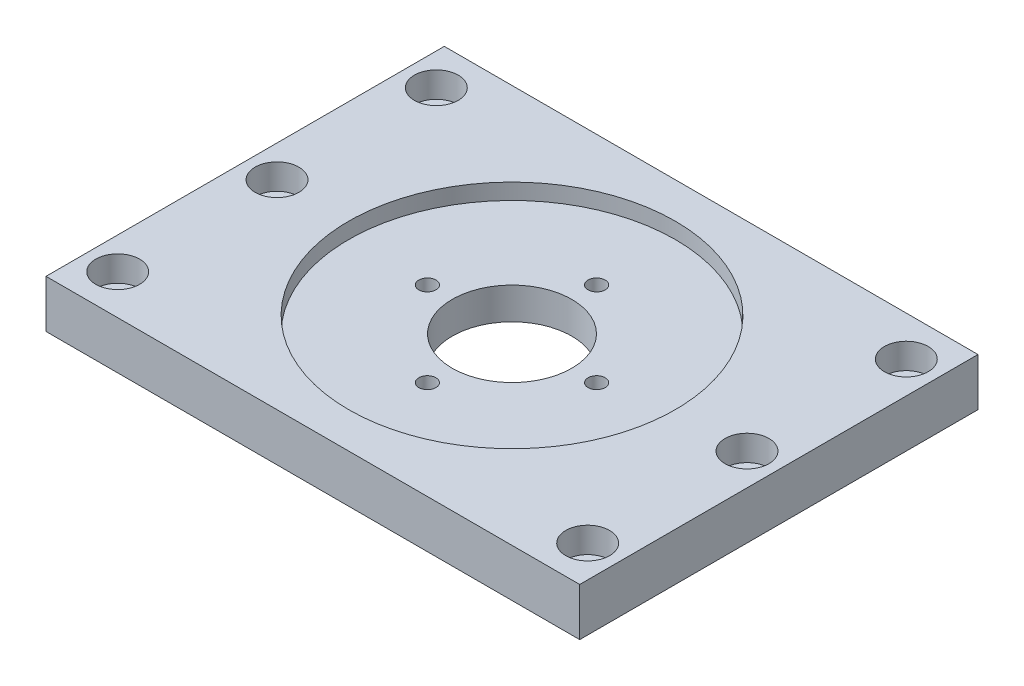
ISO-10303-21;
HEADER;
FILE_DESCRIPTION(('STEP AP214'),'2;1');
FILE_NAME('part.step','',(''),(''),'','','');
FILE_SCHEMA(('AUTOMOTIVE_DESIGN { 1 0 10303 214 1 1 1 1 }'));
ENDSEC;
DATA;
#1=APPLICATION_CONTEXT('core data for automotive mechanical design processes');
#2=APPLICATION_PROTOCOL_DEFINITION('international standard','automotive_design',2000,#1);
#3=PRODUCT_CONTEXT('',#1,'mechanical');
#4=PRODUCT('Part','Part','',(#3));
#5=PRODUCT_RELATED_PRODUCT_CATEGORY('part','',(#4));
#6=PRODUCT_DEFINITION_FORMATION('','',#4);
#7=PRODUCT_DEFINITION_CONTEXT('part definition',#1,'design');
#8=PRODUCT_DEFINITION('design','',#6,#7);
#9=PRODUCT_DEFINITION_SHAPE('','',#8);
#10=(LENGTH_UNIT() NAMED_UNIT(*) SI_UNIT(.MILLI.,.METRE.));
#11=(NAMED_UNIT(*) PLANE_ANGLE_UNIT() SI_UNIT($,.RADIAN.));
#12=(NAMED_UNIT(*) SI_UNIT($,.STERADIAN.) SOLID_ANGLE_UNIT());
#13=UNCERTAINTY_MEASURE_WITH_UNIT(LENGTH_MEASURE(1.E-05),#10,'distance_accuracy_value','');
#14=(GEOMETRIC_REPRESENTATION_CONTEXT(3) GLOBAL_UNCERTAINTY_ASSIGNED_CONTEXT((#13)) GLOBAL_UNIT_ASSIGNED_CONTEXT((#10,
#11,#12)) REPRESENTATION_CONTEXT('',''));
#15=CARTESIAN_POINT('',(0.,0.,0.));
#16=DIRECTION('',(0.,0.,1.));
#17=DIRECTION('',(1.,0.,0.));
#18=AXIS2_PLACEMENT_3D('',#15,#16,#17);
#19=CARTESIAN_POINT('',(67.,12.,50.));
#20=DIRECTION('',(-1.,0.,0.));
#21=DIRECTION('',(0.,0.,1.));
#22=AXIS2_PLACEMENT_3D('',#19,#20,#21);
#23=PLANE('',#22);
#24=DIRECTION('',(0.,0.,-1.));
#25=VECTOR('',#24,1.);
#26=CARTESIAN_POINT('',(67.,0.,50.));
#27=LINE('',#26,#25);
#28=CARTESIAN_POINT('',(67.,0.,50.));
#29=VERTEX_POINT('',#28);
#30=CARTESIAN_POINT('',(67.,0.,-50.));
#31=VERTEX_POINT('',#30);
#32=EDGE_CURVE('E103',#29,#31,#27,.T.);
#33=ORIENTED_EDGE('',*,*,#32,.T.);
#34=DIRECTION('',(0.,-1.,0.));
#35=VECTOR('',#34,1.);
#36=CARTESIAN_POINT('',(67.,12.,-50.));
#37=LINE('',#36,#35);
#38=CARTESIAN_POINT('',(67.,12.,-50.));
#39=VERTEX_POINT('',#38);
#40=EDGE_CURVE('E11',#39,#31,#37,.T.);
#41=ORIENTED_EDGE('',*,*,#40,.F.);
#42=DIRECTION('',(0.,0.,-1.));
#43=VECTOR('',#42,1.);
#44=CARTESIAN_POINT('',(67.,12.,50.));
#45=LINE('',#44,#43);
#46=CARTESIAN_POINT('',(67.,12.,50.));
#47=VERTEX_POINT('',#46);
#48=EDGE_CURVE('E90',#47,#39,#45,.T.);
#49=ORIENTED_EDGE('',*,*,#48,.F.);
#50=DIRECTION('',(0.,-1.,0.));
#51=VECTOR('',#50,1.);
#52=CARTESIAN_POINT('',(67.,12.,50.));
#53=LINE('',#52,#51);
#54=EDGE_CURVE('E99',#47,#29,#53,.T.);
#55=ORIENTED_EDGE('',*,*,#54,.T.);
#56=EDGE_LOOP('',(#33,#41,#49,#55));
#57=FACE_BOUND('',#56,.T.);
#58=ADVANCED_FACE('F37',(#57),#23,.F.);
#59=CARTESIAN_POINT('',(-67.,12.,-50.));
#60=DIRECTION('',(0.,0.,1.));
#61=DIRECTION('',(1.,0.,0.));
#62=AXIS2_PLACEMENT_3D('',#59,#60,#61);
#63=PLANE('',#62);
#64=DIRECTION('',(-1.,0.,0.));
#65=VECTOR('',#64,1.);
#66=CARTESIAN_POINT('',(-67.,0.,-50.));
#67=LINE('',#66,#65);
#68=CARTESIAN_POINT('',(-67.,0.,-50.));
#69=VERTEX_POINT('',#68);
#70=EDGE_CURVE('E94',#31,#69,#67,.T.);
#71=ORIENTED_EDGE('',*,*,#70,.T.);
#72=DIRECTION('',(0.,-1.,0.));
#73=VECTOR('',#72,1.);
#74=CARTESIAN_POINT('',(-67.,12.,-50.));
#75=LINE('',#74,#73);
#76=CARTESIAN_POINT('',(-67.,12.,-50.));
#77=VERTEX_POINT('',#76);
#78=EDGE_CURVE('E46',#77,#69,#75,.T.);
#79=ORIENTED_EDGE('',*,*,#78,.F.);
#80=DIRECTION('',(-1.,0.,0.));
#81=VECTOR('',#80,1.);
#82=CARTESIAN_POINT('',(-67.,12.,-50.));
#83=LINE('',#82,#81);
#84=EDGE_CURVE('E85',#39,#77,#83,.T.);
#85=ORIENTED_EDGE('',*,*,#84,.F.);
#86=ORIENTED_EDGE('',*,*,#40,.T.);
#87=EDGE_LOOP('',(#71,#79,#85,#86));
#88=FACE_BOUND('',#87,.T.);
#89=ADVANCED_FACE('F93',(#88),#63,.F.);
#90=CARTESIAN_POINT('',(-67.,12.,50.));
#91=DIRECTION('',(1.,0.,0.));
#92=DIRECTION('',(0.,0.,-1.));
#93=AXIS2_PLACEMENT_3D('',#90,#91,#92);
#94=PLANE('',#93);
#95=DIRECTION('',(0.,0.,1.));
#96=VECTOR('',#95,1.);
#97=CARTESIAN_POINT('',(-67.,0.,50.));
#98=LINE('',#97,#96);
#99=CARTESIAN_POINT('',(-67.,0.,50.));
#100=VERTEX_POINT('',#99);
#101=EDGE_CURVE('E72',#69,#100,#98,.T.);
#102=ORIENTED_EDGE('',*,*,#101,.T.);
#103=DIRECTION('',(0.,-1.,0.));
#104=VECTOR('',#103,1.);
#105=CARTESIAN_POINT('',(-67.,12.,50.));
#106=LINE('',#105,#104);
#107=CARTESIAN_POINT('',(-67.,12.,50.));
#108=VERTEX_POINT('',#107);
#109=EDGE_CURVE('E95',#108,#100,#106,.T.);
#110=ORIENTED_EDGE('',*,*,#109,.F.);
#111=DIRECTION('',(0.,0.,1.));
#112=VECTOR('',#111,1.);
#113=CARTESIAN_POINT('',(-67.,12.,50.));
#114=LINE('',#113,#112);
#115=EDGE_CURVE('E88',#77,#108,#114,.T.);
#116=ORIENTED_EDGE('',*,*,#115,.F.);
#117=ORIENTED_EDGE('',*,*,#78,.T.);
#118=EDGE_LOOP('',(#102,#110,#116,#117));
#119=FACE_BOUND('',#118,.T.);
#120=ADVANCED_FACE('F97',(#119),#94,.F.);
#121=CARTESIAN_POINT('',(-67.,12.,50.));
#122=DIRECTION('',(0.,0.,-1.));
#123=DIRECTION('',(-1.,0.,0.));
#124=AXIS2_PLACEMENT_3D('',#121,#122,#123);
#125=PLANE('',#124);
#126=DIRECTION('',(1.,0.,0.));
#127=VECTOR('',#126,1.);
#128=CARTESIAN_POINT('',(-67.,0.,50.));
#129=LINE('',#128,#127);
#130=EDGE_CURVE('E78',#100,#29,#129,.T.);
#131=ORIENTED_EDGE('',*,*,#130,.T.);
#132=ORIENTED_EDGE('',*,*,#54,.F.);
#133=DIRECTION('',(1.,0.,0.));
#134=VECTOR('',#133,1.);
#135=CARTESIAN_POINT('',(-67.,12.,50.));
#136=LINE('',#135,#134);
#137=EDGE_CURVE('E55',#108,#47,#136,.T.);
#138=ORIENTED_EDGE('',*,*,#137,.F.);
#139=ORIENTED_EDGE('',*,*,#109,.T.);
#140=EDGE_LOOP('',(#131,#132,#138,#139));
#141=FACE_BOUND('',#140,.T.);
#142=ADVANCED_FACE('F214',(#141),#125,.F.);
#143=CARTESIAN_POINT('',(0.,12.,0.));
#144=DIRECTION('',(0.,-1.,0.));
#145=DIRECTION('',(0.,0.,-1.));
#146=AXIS2_PLACEMENT_3D('',#143,#144,#145);
#147=PLANE('',#146);
#148=CARTESIAN_POINT('',(59.,12.,-40.));
#149=DIRECTION('',(0.,1.,0.));
#150=DIRECTION('',(0.,0.,1.));
#151=AXIS2_PLACEMENT_3D('',#148,#149,#150);
#152=CIRCLE('',#151,5.5);
#153=CARTESIAN_POINT('',(59.,12.,-34.5));
#154=VERTEX_POINT('',#153);
#155=EDGE_CURVE('E449',#154,#154,#152,.T.);
#156=ORIENTED_EDGE('',*,*,#155,.F.);
#157=EDGE_LOOP('',(#156));
#158=FACE_BOUND('',#157,.T.);
#159=CARTESIAN_POINT('',(-59.,12.,-40.));
#160=DIRECTION('',(0.,1.,0.));
#161=DIRECTION('',(0.,0.,1.));
#162=AXIS2_PLACEMENT_3D('',#159,#160,#161);
#163=CIRCLE('',#162,5.5);
#164=CARTESIAN_POINT('',(-59.,12.,-34.5));
#165=VERTEX_POINT('',#164);
#166=EDGE_CURVE('E146',#165,#165,#163,.T.);
#167=ORIENTED_EDGE('',*,*,#166,.F.);
#168=EDGE_LOOP('',(#167));
#169=FACE_BOUND('',#168,.T.);
#170=CARTESIAN_POINT('',(-58.999999999999,12.,2.44942954807925E-12));
#171=DIRECTION('',(0.,1.,0.));
#172=DIRECTION('',(0.,0.,1.));
#173=AXIS2_PLACEMENT_3D('',#170,#171,#172);
#174=CIRCLE('',#173,5.5);
#175=CARTESIAN_POINT('',(-58.999999999999,12.,5.50000000000245));
#176=VERTEX_POINT('',#175);
#177=EDGE_CURVE('E133',#176,#176,#174,.T.);
#178=ORIENTED_EDGE('',*,*,#177,.F.);
#179=EDGE_LOOP('',(#178));
#180=FACE_BOUND('',#179,.T.);
#181=CARTESIAN_POINT('',(-58.999999999998,12.,40.0000000000024));
#182=DIRECTION('',(0.,1.,0.));
#183=DIRECTION('',(0.,0.,1.));
#184=AXIS2_PLACEMENT_3D('',#181,#182,#183);
#185=CIRCLE('',#184,5.5);
#186=CARTESIAN_POINT('',(-58.999999999998,12.,45.5000000000024));
#187=VERTEX_POINT('',#186);
#188=EDGE_CURVE('E129',#187,#187,#185,.T.);
#189=ORIENTED_EDGE('',*,*,#188,.F.);
#190=EDGE_LOOP('',(#189));
#191=FACE_BOUND('',#190,.T.);
#192=CARTESIAN_POINT('',(59.000000000001,12.,0.));
#193=DIRECTION('',(0.,1.,0.));
#194=DIRECTION('',(0.,0.,1.));
#195=AXIS2_PLACEMENT_3D('',#192,#193,#194);
#196=CIRCLE('',#195,5.5);
#197=CARTESIAN_POINT('',(59.000000000001,12.,5.5));
#198=VERTEX_POINT('',#197);
#199=EDGE_CURVE('E125',#198,#198,#196,.T.);
#200=ORIENTED_EDGE('',*,*,#199,.F.);
#201=EDGE_LOOP('',(#200));
#202=FACE_BOUND('',#201,.T.);
#203=CARTESIAN_POINT('',(59.000000000002,12.,40.));
#204=DIRECTION('',(0.,1.,0.));
#205=DIRECTION('',(0.,0.,1.));
#206=AXIS2_PLACEMENT_3D('',#203,#204,#205);
#207=CIRCLE('',#206,5.5);
#208=CARTESIAN_POINT('',(59.000000000002,12.,45.5));
#209=VERTEX_POINT('',#208);
#210=EDGE_CURVE('E120',#209,#209,#207,.T.);
#211=ORIENTED_EDGE('',*,*,#210,.F.);
#212=EDGE_LOOP('',(#211));
#213=FACE_BOUND('',#212,.T.);
#214=CARTESIAN_POINT('',(0.,12.,0.));
#215=DIRECTION('',(0.,1.,0.));
#216=DIRECTION('',(0.,0.,1.));
#217=AXIS2_PLACEMENT_3D('',#214,#215,#216);
#218=CIRCLE('',#217,41.);
#219=CARTESIAN_POINT('',(0.,12.,41.));
#220=VERTEX_POINT('',#219);
#221=EDGE_CURVE('E202',#220,#220,#218,.T.);
#222=ORIENTED_EDGE('',*,*,#221,.F.);
#223=EDGE_LOOP('',(#222));
#224=FACE_BOUND('',#223,.T.);
#225=ORIENTED_EDGE('',*,*,#48,.T.);
#226=ORIENTED_EDGE('',*,*,#84,.T.);
#227=ORIENTED_EDGE('',*,*,#115,.T.);
#228=ORIENTED_EDGE('',*,*,#137,.T.);
#229=EDGE_LOOP('',(#225,#226,#227,#228));
#230=FACE_BOUND('',#229,.T.);
#231=ADVANCED_FACE('F86',(#158,#169,#180,#191,#202,#213,#224,#230),#147,.F.);
#232=CARTESIAN_POINT('',(0.,0.,0.));
#233=DIRECTION('',(0.,-1.,0.));
#234=DIRECTION('',(0.,0.,-1.));
#235=AXIS2_PLACEMENT_3D('',#232,#233,#234);
#236=PLANE('',#235);
#237=CARTESIAN_POINT('',(59.,0.,-40.));
#238=DIRECTION('',(0.,-1.,0.));
#239=DIRECTION('',(0.,0.,-1.));
#240=AXIS2_PLACEMENT_3D('',#237,#238,#239);
#241=CIRCLE('',#240,3.3);
#242=CARTESIAN_POINT('',(59.,0.,-43.3));
#243=VERTEX_POINT('',#242);
#244=EDGE_CURVE('E40',#243,#243,#241,.T.);
#245=ORIENTED_EDGE('',*,*,#244,.F.);
#246=EDGE_LOOP('',(#245));
#247=FACE_BOUND('',#246,.T.);
#248=CARTESIAN_POINT('',(-59.,0.,-40.));
#249=DIRECTION('',(0.,-1.,0.));
#250=DIRECTION('',(0.,0.,-1.));
#251=AXIS2_PLACEMENT_3D('',#248,#249,#250);
#252=CIRCLE('',#251,3.3);
#253=CARTESIAN_POINT('',(-59.,0.,-43.3));
#254=VERTEX_POINT('',#253);
#255=EDGE_CURVE('E131',#254,#254,#252,.T.);
#256=ORIENTED_EDGE('',*,*,#255,.F.);
#257=EDGE_LOOP('',(#256));
#258=FACE_BOUND('',#257,.T.);
#259=CARTESIAN_POINT('',(-58.999999999999,0.,2.44942954807925E-12));
#260=DIRECTION('',(0.,-1.,0.));
#261=DIRECTION('',(0.,0.,-1.));
#262=AXIS2_PLACEMENT_3D('',#259,#260,#261);
#263=CIRCLE('',#262,3.3);
#264=CARTESIAN_POINT('',(-58.999999999999,0.,-3.29999999999755));
#265=VERTEX_POINT('',#264);
#266=EDGE_CURVE('E127',#265,#265,#263,.T.);
#267=ORIENTED_EDGE('',*,*,#266,.F.);
#268=EDGE_LOOP('',(#267));
#269=FACE_BOUND('',#268,.T.);
#270=CARTESIAN_POINT('',(-58.999999999998,0.,40.0000000000024));
#271=DIRECTION('',(0.,-1.,0.));
#272=DIRECTION('',(0.,0.,-1.));
#273=AXIS2_PLACEMENT_3D('',#270,#271,#272);
#274=CIRCLE('',#273,3.3);
#275=CARTESIAN_POINT('',(-58.999999999998,0.,36.7000000000024));
#276=VERTEX_POINT('',#275);
#277=EDGE_CURVE('E122',#276,#276,#274,.T.);
#278=ORIENTED_EDGE('',*,*,#277,.F.);
#279=EDGE_LOOP('',(#278));
#280=FACE_BOUND('',#279,.T.);
#281=CARTESIAN_POINT('',(59.000000000001,0.,0.));
#282=DIRECTION('',(0.,-1.,0.));
#283=DIRECTION('',(0.,0.,-1.));
#284=AXIS2_PLACEMENT_3D('',#281,#282,#283);
#285=CIRCLE('',#284,3.3);
#286=CARTESIAN_POINT('',(59.000000000001,0.,-3.3));
#287=VERTEX_POINT('',#286);
#288=EDGE_CURVE('E117',#287,#287,#285,.T.);
#289=ORIENTED_EDGE('',*,*,#288,.F.);
#290=EDGE_LOOP('',(#289));
#291=FACE_BOUND('',#290,.T.);
#292=CARTESIAN_POINT('',(59.000000000002,0.,40.));
#293=DIRECTION('',(0.,-1.,0.));
#294=DIRECTION('',(0.,0.,-1.));
#295=AXIS2_PLACEMENT_3D('',#292,#293,#294);
#296=CIRCLE('',#295,3.3);
#297=CARTESIAN_POINT('',(59.000000000002,0.,36.7));
#298=VERTEX_POINT('',#297);
#299=EDGE_CURVE('E112',#298,#298,#296,.T.);
#300=ORIENTED_EDGE('',*,*,#299,.F.);
#301=EDGE_LOOP('',(#300));
#302=FACE_BOUND('',#301,.T.);
#303=CARTESIAN_POINT('',(0.,0.,-21.25));
#304=DIRECTION('',(0.,-1.,0.));
#305=DIRECTION('',(0.,0.,-1.));
#306=AXIS2_PLACEMENT_3D('',#303,#304,#305);
#307=CIRCLE('',#306,2.15);
#308=CARTESIAN_POINT('',(0.,0.,-23.4));
#309=VERTEX_POINT('',#308);
#310=EDGE_CURVE('E115',#309,#309,#307,.T.);
#311=ORIENTED_EDGE('',*,*,#310,.F.);
#312=EDGE_LOOP('',(#311));
#313=FACE_BOUND('',#312,.T.);
#314=CARTESIAN_POINT('',(-21.2500000000006,0.,-6.00057763723803E-13));
#315=DIRECTION('',(0.,-1.,0.));
#316=DIRECTION('',(0.,0.,-1.));
#317=AXIS2_PLACEMENT_3D('',#314,#315,#316);
#318=CIRCLE('',#317,2.15);
#319=CARTESIAN_POINT('',(-21.2500000000006,0.,-2.1500000000006));
#320=VERTEX_POINT('',#319);
#321=EDGE_CURVE('E180',#320,#320,#318,.T.);
#322=ORIENTED_EDGE('',*,*,#321,.F.);
#323=EDGE_LOOP('',(#322));
#324=FACE_BOUND('',#323,.T.);
#325=CARTESIAN_POINT('',(-1.20011552744761E-12,0.,21.25));
#326=DIRECTION('',(0.,-1.,0.));
#327=DIRECTION('',(0.,0.,-1.));
#328=AXIS2_PLACEMENT_3D('',#325,#326,#327);
#329=CIRCLE('',#328,2.15);
#330=CARTESIAN_POINT('',(-1.20011552744761E-12,0.,19.1));
#331=VERTEX_POINT('',#330);
#332=EDGE_CURVE('E186',#331,#331,#329,.T.);
#333=ORIENTED_EDGE('',*,*,#332,.F.);
#334=EDGE_LOOP('',(#333));
#335=FACE_BOUND('',#334,.T.);
#336=CARTESIAN_POINT('',(21.2499999999994,0.,5.97455389275615E-13));
#337=DIRECTION('',(0.,-1.,0.));
#338=DIRECTION('',(0.,0.,-1.));
#339=AXIS2_PLACEMENT_3D('',#336,#337,#338);
#340=CIRCLE('',#339,2.15);
#341=CARTESIAN_POINT('',(21.2499999999994,0.,-2.1499999999994));
#342=VERTEX_POINT('',#341);
#343=EDGE_CURVE('E192',#342,#342,#340,.T.);
#344=ORIENTED_EDGE('',*,*,#343,.F.);
#345=EDGE_LOOP('',(#344));
#346=FACE_BOUND('',#345,.T.);
#347=CARTESIAN_POINT('',(0.,0.,0.));
#348=DIRECTION('',(0.,1.,0.));
#349=DIRECTION('',(0.,0.,1.));
#350=AXIS2_PLACEMENT_3D('',#347,#348,#349);
#351=CIRCLE('',#350,15.);
#352=CARTESIAN_POINT('',(0.,0.,15.));
#353=VERTEX_POINT('',#352);
#354=EDGE_CURVE('E199',#353,#353,#351,.T.);
#355=ORIENTED_EDGE('',*,*,#354,.T.);
#356=EDGE_LOOP('',(#355));
#357=FACE_BOUND('',#356,.T.);
#358=ORIENTED_EDGE('',*,*,#32,.F.);
#359=ORIENTED_EDGE('',*,*,#130,.F.);
#360=ORIENTED_EDGE('',*,*,#101,.F.);
#361=ORIENTED_EDGE('',*,*,#70,.F.);
#362=EDGE_LOOP('',(#358,#359,#360,#361));
#363=FACE_BOUND('',#362,.T.);
#364=ADVANCED_FACE('F213',(#247,#258,#269,#280,#291,#302,#313,#324,#335,#346,#357,#363),#236,.T.);
#365=CARTESIAN_POINT('',(0.,8.,0.));
#366=DIRECTION('',(0.,1.,0.));
#367=DIRECTION('',(0.,0.,1.));
#368=AXIS2_PLACEMENT_3D('',#365,#366,#367);
#369=CYLINDRICAL_SURFACE('',#368,41.);
#370=CARTESIAN_POINT('',(0.,8.,0.));
#371=DIRECTION('',(0.,1.,0.));
#372=DIRECTION('',(0.,0.,1.));
#373=AXIS2_PLACEMENT_3D('',#370,#371,#372);
#374=CIRCLE('',#373,41.);
#375=CARTESIAN_POINT('',(0.,8.,41.));
#376=VERTEX_POINT('',#375);
#377=EDGE_CURVE('E106',#376,#376,#374,.T.);
#378=ORIENTED_EDGE('',*,*,#377,.F.);
#379=EDGE_LOOP('',(#378));
#380=FACE_BOUND('',#379,.T.);
#381=ORIENTED_EDGE('',*,*,#221,.T.);
#382=EDGE_LOOP('',(#381));
#383=FACE_BOUND('',#382,.T.);
#384=ADVANCED_FACE('F210',(#380,#383),#369,.F.);
#385=CARTESIAN_POINT('',(0.,8.,0.));
#386=DIRECTION('',(0.,1.,0.));
#387=DIRECTION('',(0.,0.,1.));
#388=AXIS2_PLACEMENT_3D('',#385,#386,#387);
#389=PLANE('',#388);
#390=CARTESIAN_POINT('',(0.,8.,-21.25));
#391=DIRECTION('',(0.,1.,0.));
#392=DIRECTION('',(0.,0.,1.));
#393=AXIS2_PLACEMENT_3D('',#390,#391,#392);
#394=CIRCLE('',#393,2.15);
#395=CARTESIAN_POINT('',(0.,8.,-19.1));
#396=VERTEX_POINT('',#395);
#397=EDGE_CURVE('E177',#396,#396,#394,.T.);
#398=ORIENTED_EDGE('',*,*,#397,.F.);
#399=EDGE_LOOP('',(#398));
#400=FACE_BOUND('',#399,.T.);
#401=CARTESIAN_POINT('',(-21.2500000000006,8.,-6.00057763723803E-13));
#402=DIRECTION('',(0.,1.,0.));
#403=DIRECTION('',(0.,0.,1.));
#404=AXIS2_PLACEMENT_3D('',#401,#402,#403);
#405=CIRCLE('',#404,2.15);
#406=CARTESIAN_POINT('',(-21.2500000000006,8.,2.1499999999994));
#407=VERTEX_POINT('',#406);
#408=EDGE_CURVE('E183',#407,#407,#405,.T.);
#409=ORIENTED_EDGE('',*,*,#408,.F.);
#410=EDGE_LOOP('',(#409));
#411=FACE_BOUND('',#410,.T.);
#412=CARTESIAN_POINT('',(-1.20011552744761E-12,8.,21.25));
#413=DIRECTION('',(0.,1.,0.));
#414=DIRECTION('',(0.,0.,1.));
#415=AXIS2_PLACEMENT_3D('',#412,#413,#414);
#416=CIRCLE('',#415,2.15);
#417=CARTESIAN_POINT('',(-1.20011552744761E-12,8.,23.4));
#418=VERTEX_POINT('',#417);
#419=EDGE_CURVE('E189',#418,#418,#416,.T.);
#420=ORIENTED_EDGE('',*,*,#419,.F.);
#421=EDGE_LOOP('',(#420));
#422=FACE_BOUND('',#421,.T.);
#423=CARTESIAN_POINT('',(21.2499999999994,8.,5.97455389275615E-13));
#424=DIRECTION('',(0.,1.,0.));
#425=DIRECTION('',(0.,0.,1.));
#426=AXIS2_PLACEMENT_3D('',#423,#424,#425);
#427=CIRCLE('',#426,2.15);
#428=CARTESIAN_POINT('',(21.2499999999994,8.,2.15000000000059));
#429=VERTEX_POINT('',#428);
#430=EDGE_CURVE('E195',#429,#429,#427,.T.);
#431=ORIENTED_EDGE('',*,*,#430,.F.);
#432=EDGE_LOOP('',(#431));
#433=FACE_BOUND('',#432,.T.);
#434=CARTESIAN_POINT('',(0.,8.,0.));
#435=DIRECTION('',(0.,1.,0.));
#436=DIRECTION('',(0.,0.,1.));
#437=AXIS2_PLACEMENT_3D('',#434,#435,#436);
#438=CIRCLE('',#437,15.);
#439=CARTESIAN_POINT('',(0.,8.,15.));
#440=VERTEX_POINT('',#439);
#441=EDGE_CURVE('E198',#440,#440,#438,.T.);
#442=ORIENTED_EDGE('',*,*,#441,.F.);
#443=EDGE_LOOP('',(#442));
#444=FACE_BOUND('',#443,.T.);
#445=ORIENTED_EDGE('',*,*,#377,.T.);
#446=EDGE_LOOP('',(#445));
#447=FACE_BOUND('',#446,.T.);
#448=ADVANCED_FACE('F251',(#400,#411,#422,#433,#444,#447),#389,.T.);
#449=CARTESIAN_POINT('',(0.,0.,0.));
#450=DIRECTION('',(0.,1.,0.));
#451=DIRECTION('',(0.,0.,1.));
#452=AXIS2_PLACEMENT_3D('',#449,#450,#451);
#453=CYLINDRICAL_SURFACE('',#452,15.);
#454=ORIENTED_EDGE('',*,*,#354,.F.);
#455=EDGE_LOOP('',(#454));
#456=FACE_BOUND('',#455,.T.);
#457=ORIENTED_EDGE('',*,*,#441,.T.);
#458=EDGE_LOOP('',(#457));
#459=FACE_BOUND('',#458,.T.);
#460=ADVANCED_FACE('F257',(#456,#459),#453,.F.);
#461=CARTESIAN_POINT('',(21.2499999999994,0.,5.97455389275615E-13));
#462=DIRECTION('',(0.,-1.,0.));
#463=DIRECTION('',(0.,0.,-1.));
#464=AXIS2_PLACEMENT_3D('',#461,#462,#463);
#465=CYLINDRICAL_SURFACE('',#464,2.15);
#466=ORIENTED_EDGE('',*,*,#430,.T.);
#467=EDGE_LOOP('',(#466));
#468=FACE_BOUND('',#467,.T.);
#469=ORIENTED_EDGE('',*,*,#343,.T.);
#470=EDGE_LOOP('',(#469));
#471=FACE_BOUND('',#470,.T.);
#472=ADVANCED_FACE('F261',(#468,#471),#465,.F.);
#473=CARTESIAN_POINT('',(-1.20011552744761E-12,0.,21.25));
#474=DIRECTION('',(0.,-1.,0.));
#475=DIRECTION('',(0.,0.,-1.));
#476=AXIS2_PLACEMENT_3D('',#473,#474,#475);
#477=CYLINDRICAL_SURFACE('',#476,2.15);
#478=ORIENTED_EDGE('',*,*,#419,.T.);
#479=EDGE_LOOP('',(#478));
#480=FACE_BOUND('',#479,.T.);
#481=ORIENTED_EDGE('',*,*,#332,.T.);
#482=EDGE_LOOP('',(#481));
#483=FACE_BOUND('',#482,.T.);
#484=ADVANCED_FACE('F275',(#480,#483),#477,.F.);
#485=CARTESIAN_POINT('',(-21.2500000000006,0.,-6.00057763723803E-13));
#486=DIRECTION('',(0.,-1.,0.));
#487=DIRECTION('',(0.,0.,-1.));
#488=AXIS2_PLACEMENT_3D('',#485,#486,#487);
#489=CYLINDRICAL_SURFACE('',#488,2.15);
#490=ORIENTED_EDGE('',*,*,#408,.T.);
#491=EDGE_LOOP('',(#490));
#492=FACE_BOUND('',#491,.T.);
#493=ORIENTED_EDGE('',*,*,#321,.T.);
#494=EDGE_LOOP('',(#493));
#495=FACE_BOUND('',#494,.T.);
#496=ADVANCED_FACE('F283',(#492,#495),#489,.F.);
#497=CARTESIAN_POINT('',(0.,0.,-21.25));
#498=DIRECTION('',(0.,-1.,0.));
#499=DIRECTION('',(0.,0.,-1.));
#500=AXIS2_PLACEMENT_3D('',#497,#498,#499);
#501=CYLINDRICAL_SURFACE('',#500,2.15);
#502=ORIENTED_EDGE('',*,*,#397,.T.);
#503=EDGE_LOOP('',(#502));
#504=FACE_BOUND('',#503,.T.);
#505=ORIENTED_EDGE('',*,*,#310,.T.);
#506=EDGE_LOOP('',(#505));
#507=FACE_BOUND('',#506,.T.);
#508=ADVANCED_FACE('F290',(#504,#507),#501,.F.);
#509=CARTESIAN_POINT('',(59.000000000002,12.,40.));
#510=DIRECTION('',(0.,1.,0.));
#511=DIRECTION('',(0.,0.,1.));
#512=AXIS2_PLACEMENT_3D('',#509,#510,#511);
#513=CYLINDRICAL_SURFACE('',#512,3.3);
#514=ORIENTED_EDGE('',*,*,#299,.T.);
#515=EDGE_LOOP('',(#514));
#516=FACE_BOUND('',#515,.T.);
#517=CARTESIAN_POINT('',(59.000000000002,5.6,40.));
#518=DIRECTION('',(0.,1.,0.));
#519=DIRECTION('',(0.,0.,1.));
#520=AXIS2_PLACEMENT_3D('',#517,#518,#519);
#521=CIRCLE('',#520,3.3);
#522=CARTESIAN_POINT('',(59.000000000002,5.6,43.3));
#523=VERTEX_POINT('',#522);
#524=EDGE_CURVE('E116',#523,#523,#521,.T.);
#525=ORIENTED_EDGE('',*,*,#524,.T.);
#526=EDGE_LOOP('',(#525));
#527=FACE_BOUND('',#526,.T.);
#528=ADVANCED_FACE('F297',(#516,#527),#513,.F.);
#529=CARTESIAN_POINT('',(62.300000000002,5.6,40.));
#530=DIRECTION('',(0.,-1.,0.));
#531=DIRECTION('',(0.,0.,-1.));
#532=AXIS2_PLACEMENT_3D('',#529,#530,#531);
#533=PLANE('',#532);
#534=ORIENTED_EDGE('',*,*,#524,.F.);
#535=EDGE_LOOP('',(#534));
#536=FACE_BOUND('',#535,.T.);
#537=CARTESIAN_POINT('',(59.000000000002,5.6,40.));
#538=DIRECTION('',(0.,1.,0.));
#539=DIRECTION('',(0.,0.,1.));
#540=AXIS2_PLACEMENT_3D('',#537,#538,#539);
#541=CIRCLE('',#540,5.5);
#542=CARTESIAN_POINT('',(59.000000000002,5.6,45.5));
#543=VERTEX_POINT('',#542);
#544=EDGE_CURVE('E170',#543,#543,#541,.T.);
#545=ORIENTED_EDGE('',*,*,#544,.T.);
#546=EDGE_LOOP('',(#545));
#547=FACE_BOUND('',#546,.T.);
#548=ADVANCED_FACE('F307',(#536,#547),#533,.F.);
#549=CARTESIAN_POINT('',(59.000000000002,12.,40.));
#550=DIRECTION('',(0.,1.,0.));
#551=DIRECTION('',(0.,0.,1.));
#552=AXIS2_PLACEMENT_3D('',#549,#550,#551);
#553=CYLINDRICAL_SURFACE('',#552,5.5);
#554=ORIENTED_EDGE('',*,*,#544,.F.);
#555=EDGE_LOOP('',(#554));
#556=FACE_BOUND('',#555,.T.);
#557=ORIENTED_EDGE('',*,*,#210,.T.);
#558=EDGE_LOOP('',(#557));
#559=FACE_BOUND('',#558,.T.);
#560=ADVANCED_FACE('F315',(#556,#559),#553,.F.);
#561=CARTESIAN_POINT('',(59.000000000001,12.,0.));
#562=DIRECTION('',(0.,1.,0.));
#563=DIRECTION('',(0.,0.,1.));
#564=AXIS2_PLACEMENT_3D('',#561,#562,#563);
#565=CYLINDRICAL_SURFACE('',#564,3.3);
#566=ORIENTED_EDGE('',*,*,#288,.T.);
#567=EDGE_LOOP('',(#566));
#568=FACE_BOUND('',#567,.T.);
#569=CARTESIAN_POINT('',(59.000000000001,5.6,0.));
#570=DIRECTION('',(0.,1.,0.));
#571=DIRECTION('',(0.,0.,1.));
#572=AXIS2_PLACEMENT_3D('',#569,#570,#571);
#573=CIRCLE('',#572,3.3);
#574=CARTESIAN_POINT('',(59.000000000001,5.6,3.3));
#575=VERTEX_POINT('',#574);
#576=EDGE_CURVE('E121',#575,#575,#573,.T.);
#577=ORIENTED_EDGE('',*,*,#576,.T.);
#578=EDGE_LOOP('',(#577));
#579=FACE_BOUND('',#578,.T.);
#580=ADVANCED_FACE('F323',(#568,#579),#565,.F.);
#581=CARTESIAN_POINT('',(62.300000000001,5.6,0.));
#582=DIRECTION('',(0.,-1.,0.));
#583=DIRECTION('',(0.,0.,-1.));
#584=AXIS2_PLACEMENT_3D('',#581,#582,#583);
#585=PLANE('',#584);
#586=ORIENTED_EDGE('',*,*,#576,.F.);
#587=EDGE_LOOP('',(#586));
#588=FACE_BOUND('',#587,.T.);
#589=CARTESIAN_POINT('',(59.000000000001,5.6,0.));
#590=DIRECTION('',(0.,1.,0.));
#591=DIRECTION('',(0.,0.,1.));
#592=AXIS2_PLACEMENT_3D('',#589,#590,#591);
#593=CIRCLE('',#592,5.5);
#594=CARTESIAN_POINT('',(59.000000000001,5.6,5.5));
#595=VERTEX_POINT('',#594);
#596=EDGE_CURVE('E163',#595,#595,#593,.T.);
#597=ORIENTED_EDGE('',*,*,#596,.T.);
#598=EDGE_LOOP('',(#597));
#599=FACE_BOUND('',#598,.T.);
#600=ADVANCED_FACE('F331',(#588,#599),#585,.F.);
#601=CARTESIAN_POINT('',(59.000000000001,12.,0.));
#602=DIRECTION('',(0.,1.,0.));
#603=DIRECTION('',(0.,0.,1.));
#604=AXIS2_PLACEMENT_3D('',#601,#602,#603);
#605=CYLINDRICAL_SURFACE('',#604,5.5);
#606=ORIENTED_EDGE('',*,*,#596,.F.);
#607=EDGE_LOOP('',(#606));
#608=FACE_BOUND('',#607,.T.);
#609=ORIENTED_EDGE('',*,*,#199,.T.);
#610=EDGE_LOOP('',(#609));
#611=FACE_BOUND('',#610,.T.);
#612=ADVANCED_FACE('F339',(#608,#611),#605,.F.);
#613=CARTESIAN_POINT('',(-58.999999999998,12.,40.0000000000024));
#614=DIRECTION('',(0.,1.,0.));
#615=DIRECTION('',(0.,0.,1.));
#616=AXIS2_PLACEMENT_3D('',#613,#614,#615);
#617=CYLINDRICAL_SURFACE('',#616,3.3);
#618=ORIENTED_EDGE('',*,*,#277,.T.);
#619=EDGE_LOOP('',(#618));
#620=FACE_BOUND('',#619,.T.);
#621=CARTESIAN_POINT('',(-58.999999999998,5.6,40.0000000000024));
#622=DIRECTION('',(0.,1.,0.));
#623=DIRECTION('',(0.,0.,1.));
#624=AXIS2_PLACEMENT_3D('',#621,#622,#623);
#625=CIRCLE('',#624,3.3);
#626=CARTESIAN_POINT('',(-58.999999999998,5.6,43.3000000000024));
#627=VERTEX_POINT('',#626);
#628=EDGE_CURVE('E126',#627,#627,#625,.T.);
#629=ORIENTED_EDGE('',*,*,#628,.T.);
#630=EDGE_LOOP('',(#629));
#631=FACE_BOUND('',#630,.T.);
#632=ADVANCED_FACE('F347',(#620,#631),#617,.F.);
#633=CARTESIAN_POINT('',(-55.699999999998,5.6,40.0000000000024));
#634=DIRECTION('',(0.,-1.,0.));
#635=DIRECTION('',(0.,0.,-1.));
#636=AXIS2_PLACEMENT_3D('',#633,#634,#635);
#637=PLANE('',#636);
#638=ORIENTED_EDGE('',*,*,#628,.F.);
#639=EDGE_LOOP('',(#638));
#640=FACE_BOUND('',#639,.T.);
#641=CARTESIAN_POINT('',(-58.999999999998,5.6,40.0000000000024));
#642=DIRECTION('',(0.,1.,0.));
#643=DIRECTION('',(0.,0.,1.));
#644=AXIS2_PLACEMENT_3D('',#641,#642,#643);
#645=CIRCLE('',#644,5.5);
#646=CARTESIAN_POINT('',(-58.999999999998,5.6,45.5000000000024));
#647=VERTEX_POINT('',#646);
#648=EDGE_CURVE('E156',#647,#647,#645,.T.);
#649=ORIENTED_EDGE('',*,*,#648,.T.);
#650=EDGE_LOOP('',(#649));
#651=FACE_BOUND('',#650,.T.);
#652=ADVANCED_FACE('F355',(#640,#651),#637,.F.);
#653=CARTESIAN_POINT('',(-58.999999999998,12.,40.0000000000024));
#654=DIRECTION('',(0.,1.,0.));
#655=DIRECTION('',(0.,0.,1.));
#656=AXIS2_PLACEMENT_3D('',#653,#654,#655);
#657=CYLINDRICAL_SURFACE('',#656,5.5);
#658=ORIENTED_EDGE('',*,*,#648,.F.);
#659=EDGE_LOOP('',(#658));
#660=FACE_BOUND('',#659,.T.);
#661=ORIENTED_EDGE('',*,*,#188,.T.);
#662=EDGE_LOOP('',(#661));
#663=FACE_BOUND('',#662,.T.);
#664=ADVANCED_FACE('F363',(#660,#663),#657,.F.);
#665=CARTESIAN_POINT('',(-58.999999999999,12.,2.44942954807925E-12));
#666=DIRECTION('',(0.,1.,0.));
#667=DIRECTION('',(0.,0.,1.));
#668=AXIS2_PLACEMENT_3D('',#665,#666,#667);
#669=CYLINDRICAL_SURFACE('',#668,3.3);
#670=ORIENTED_EDGE('',*,*,#266,.T.);
#671=EDGE_LOOP('',(#670));
#672=FACE_BOUND('',#671,.T.);
#673=CARTESIAN_POINT('',(-58.999999999999,5.6,2.44942954807925E-12));
#674=DIRECTION('',(0.,1.,0.));
#675=DIRECTION('',(0.,0.,1.));
#676=AXIS2_PLACEMENT_3D('',#673,#674,#675);
#677=CIRCLE('',#676,3.3);
#678=CARTESIAN_POINT('',(-58.999999999999,5.6,3.30000000000245));
#679=VERTEX_POINT('',#678);
#680=EDGE_CURVE('E130',#679,#679,#677,.T.);
#681=ORIENTED_EDGE('',*,*,#680,.T.);
#682=EDGE_LOOP('',(#681));
#683=FACE_BOUND('',#682,.T.);
#684=ADVANCED_FACE('F371',(#672,#683),#669,.F.);
#685=CARTESIAN_POINT('',(-55.699999999999,5.6,2.44942954807925E-12));
#686=DIRECTION('',(0.,-1.,0.));
#687=DIRECTION('',(0.,0.,-1.));
#688=AXIS2_PLACEMENT_3D('',#685,#686,#687);
#689=PLANE('',#688);
#690=ORIENTED_EDGE('',*,*,#680,.F.);
#691=EDGE_LOOP('',(#690));
#692=FACE_BOUND('',#691,.T.);
#693=CARTESIAN_POINT('',(-58.999999999999,5.6,2.44942954807925E-12));
#694=DIRECTION('',(0.,1.,0.));
#695=DIRECTION('',(0.,0.,1.));
#696=AXIS2_PLACEMENT_3D('',#693,#694,#695);
#697=CIRCLE('',#696,5.5);
#698=CARTESIAN_POINT('',(-58.999999999999,5.6,5.50000000000245));
#699=VERTEX_POINT('',#698);
#700=EDGE_CURVE('E138',#699,#699,#697,.T.);
#701=ORIENTED_EDGE('',*,*,#700,.T.);
#702=EDGE_LOOP('',(#701));
#703=FACE_BOUND('',#702,.T.);
#704=ADVANCED_FACE('F379',(#692,#703),#689,.F.);
#705=CARTESIAN_POINT('',(-58.999999999999,12.,2.44942954807925E-12));
#706=DIRECTION('',(0.,1.,0.));
#707=DIRECTION('',(0.,0.,1.));
#708=AXIS2_PLACEMENT_3D('',#705,#706,#707);
#709=CYLINDRICAL_SURFACE('',#708,5.5);
#710=ORIENTED_EDGE('',*,*,#700,.F.);
#711=EDGE_LOOP('',(#710));
#712=FACE_BOUND('',#711,.T.);
#713=ORIENTED_EDGE('',*,*,#177,.T.);
#714=EDGE_LOOP('',(#713));
#715=FACE_BOUND('',#714,.T.);
#716=ADVANCED_FACE('F387',(#712,#715),#709,.F.);
#717=CARTESIAN_POINT('',(-59.,12.,-40.));
#718=DIRECTION('',(0.,1.,0.));
#719=DIRECTION('',(0.,0.,1.));
#720=AXIS2_PLACEMENT_3D('',#717,#718,#719);
#721=CYLINDRICAL_SURFACE('',#720,3.3);
#722=ORIENTED_EDGE('',*,*,#255,.T.);
#723=EDGE_LOOP('',(#722));
#724=FACE_BOUND('',#723,.T.);
#725=CARTESIAN_POINT('',(-59.,5.6,-40.));
#726=DIRECTION('',(0.,1.,0.));
#727=DIRECTION('',(0.,0.,1.));
#728=AXIS2_PLACEMENT_3D('',#725,#726,#727);
#729=CIRCLE('',#728,3.3);
#730=CARTESIAN_POINT('',(-59.,5.6,-36.7));
#731=VERTEX_POINT('',#730);
#732=EDGE_CURVE('E134',#731,#731,#729,.T.);
#733=ORIENTED_EDGE('',*,*,#732,.T.);
#734=EDGE_LOOP('',(#733));
#735=FACE_BOUND('',#734,.T.);
#736=ADVANCED_FACE('F395',(#724,#735),#721,.F.);
#737=CARTESIAN_POINT('',(-55.7,5.6,-40.));
#738=DIRECTION('',(0.,-1.,0.));
#739=DIRECTION('',(0.,0.,-1.));
#740=AXIS2_PLACEMENT_3D('',#737,#738,#739);
#741=PLANE('',#740);
#742=ORIENTED_EDGE('',*,*,#732,.F.);
#743=EDGE_LOOP('',(#742));
#744=FACE_BOUND('',#743,.T.);
#745=CARTESIAN_POINT('',(-59.,5.6,-40.));
#746=DIRECTION('',(0.,1.,0.));
#747=DIRECTION('',(0.,0.,1.));
#748=AXIS2_PLACEMENT_3D('',#745,#746,#747);
#749=CIRCLE('',#748,5.5);
#750=CARTESIAN_POINT('',(-59.,5.6,-34.5));
#751=VERTEX_POINT('',#750);
#752=EDGE_CURVE('E141',#751,#751,#749,.T.);
#753=ORIENTED_EDGE('',*,*,#752,.T.);
#754=EDGE_LOOP('',(#753));
#755=FACE_BOUND('',#754,.T.);
#756=ADVANCED_FACE('F403',(#744,#755),#741,.F.);
#757=CARTESIAN_POINT('',(-59.,12.,-40.));
#758=DIRECTION('',(0.,1.,0.));
#759=DIRECTION('',(0.,0.,1.));
#760=AXIS2_PLACEMENT_3D('',#757,#758,#759);
#761=CYLINDRICAL_SURFACE('',#760,5.5);
#762=ORIENTED_EDGE('',*,*,#752,.F.);
#763=EDGE_LOOP('',(#762));
#764=FACE_BOUND('',#763,.T.);
#765=ORIENTED_EDGE('',*,*,#166,.T.);
#766=EDGE_LOOP('',(#765));
#767=FACE_BOUND('',#766,.T.);
#768=ADVANCED_FACE('F410',(#764,#767),#761,.F.);
#769=CARTESIAN_POINT('',(59.,12.,-40.));
#770=DIRECTION('',(0.,1.,0.));
#771=DIRECTION('',(0.,0.,1.));
#772=AXIS2_PLACEMENT_3D('',#769,#770,#771);
#773=CYLINDRICAL_SURFACE('',#772,3.3);
#774=ORIENTED_EDGE('',*,*,#244,.T.);
#775=EDGE_LOOP('',(#774));
#776=FACE_BOUND('',#775,.T.);
#777=CARTESIAN_POINT('',(59.,5.6,-40.));
#778=DIRECTION('',(0.,1.,0.));
#779=DIRECTION('',(0.,0.,1.));
#780=AXIS2_PLACEMENT_3D('',#777,#778,#779);
#781=CIRCLE('',#780,3.3);
#782=CARTESIAN_POINT('',(59.,5.6,-36.7));
#783=VERTEX_POINT('',#782);
#784=EDGE_CURVE('E451',#783,#783,#781,.T.);
#785=ORIENTED_EDGE('',*,*,#784,.T.);
#786=EDGE_LOOP('',(#785));
#787=FACE_BOUND('',#786,.T.);
#788=ADVANCED_FACE('F418',(#776,#787),#773,.F.);
#789=CARTESIAN_POINT('',(62.3,5.6,-40.));
#790=DIRECTION('',(0.,-1.,0.));
#791=DIRECTION('',(0.,0.,-1.));
#792=AXIS2_PLACEMENT_3D('',#789,#790,#791);
#793=PLANE('',#792);
#794=ORIENTED_EDGE('',*,*,#784,.F.);
#795=EDGE_LOOP('',(#794));
#796=FACE_BOUND('',#795,.T.);
#797=CARTESIAN_POINT('',(59.,5.6,-40.));
#798=DIRECTION('',(0.,1.,0.));
#799=DIRECTION('',(0.,0.,1.));
#800=AXIS2_PLACEMENT_3D('',#797,#798,#799);
#801=CIRCLE('',#800,5.5);
#802=CARTESIAN_POINT('',(59.,5.6,-34.5));
#803=VERTEX_POINT('',#802);
#804=EDGE_CURVE('E447',#803,#803,#801,.T.);
#805=ORIENTED_EDGE('',*,*,#804,.T.);
#806=EDGE_LOOP('',(#805));
#807=FACE_BOUND('',#806,.T.);
#808=ADVANCED_FACE('F426',(#796,#807),#793,.F.);
#809=CARTESIAN_POINT('',(59.,12.,-40.));
#810=DIRECTION('',(0.,1.,0.));
#811=DIRECTION('',(0.,0.,1.));
#812=AXIS2_PLACEMENT_3D('',#809,#810,#811);
#813=CYLINDRICAL_SURFACE('',#812,5.5);
#814=ORIENTED_EDGE('',*,*,#804,.F.);
#815=EDGE_LOOP('',(#814));
#816=FACE_BOUND('',#815,.T.);
#817=ORIENTED_EDGE('',*,*,#155,.T.);
#818=EDGE_LOOP('',(#817));
#819=FACE_BOUND('',#818,.T.);
#820=ADVANCED_FACE('F434',(#816,#819),#813,.F.);
#821=CLOSED_SHELL('',(#58,#89,#120,#142,#231,#364,#384,#448,#460,#472,#484,#496,#508,#528,#548,
#560,#580,#600,#612,#632,#652,#664,#684,#704,#716,#736,#756,#768,#788,#808,#820));
#822=MANIFOLD_SOLID_BREP('B2',#821);
#823=ADVANCED_BREP_SHAPE_REPRESENTATION('',(#18,#822),#14);
#824=SHAPE_DEFINITION_REPRESENTATION(#9,#823);
ENDSEC;
END-ISO-10303-21;
